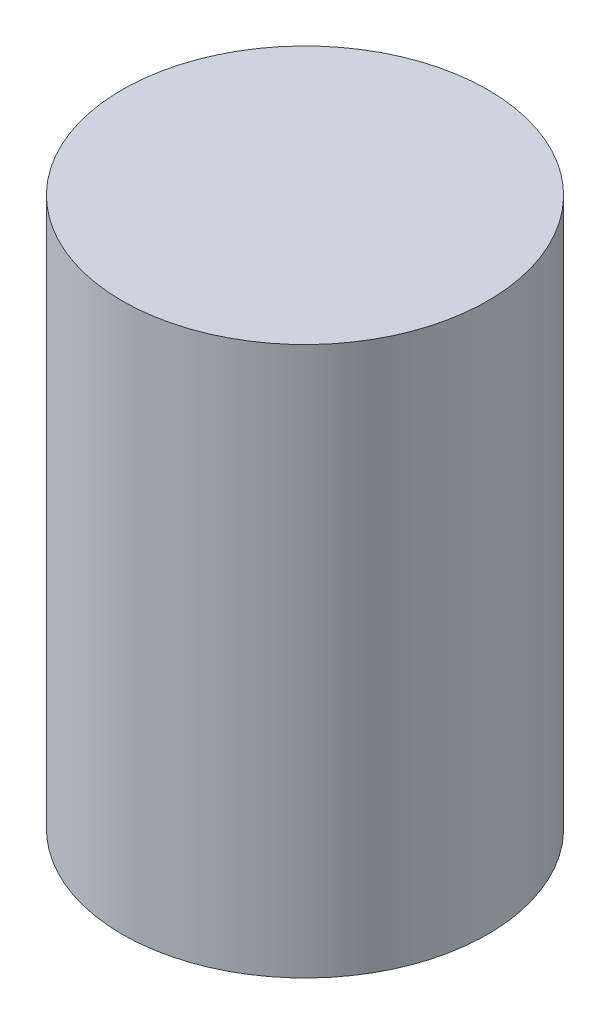
ISO-10303-21;
HEADER;
FILE_DESCRIPTION(('STEP AP214'),'2;1');
FILE_NAME('part.step','',(''),(''),'','','');
FILE_SCHEMA(('AUTOMOTIVE_DESIGN { 1 0 10303 214 1 1 1 1 }'));
ENDSEC;
DATA;
#1=APPLICATION_CONTEXT('core data for automotive mechanical design processes');
#2=APPLICATION_PROTOCOL_DEFINITION('international standard','automotive_design',2000,#1);
#3=PRODUCT_CONTEXT('',#1,'mechanical');
#4=PRODUCT('Part','Part','',(#3));
#5=PRODUCT_RELATED_PRODUCT_CATEGORY('part','',(#4));
#6=PRODUCT_DEFINITION_FORMATION('','',#4);
#7=PRODUCT_DEFINITION_CONTEXT('part definition',#1,'design');
#8=PRODUCT_DEFINITION('design','',#6,#7);
#9=PRODUCT_DEFINITION_SHAPE('','',#8);
#10=(LENGTH_UNIT() NAMED_UNIT(*) SI_UNIT(.MILLI.,.METRE.));
#11=(NAMED_UNIT(*) PLANE_ANGLE_UNIT() SI_UNIT($,.RADIAN.));
#12=(NAMED_UNIT(*) SI_UNIT($,.STERADIAN.) SOLID_ANGLE_UNIT());
#13=UNCERTAINTY_MEASURE_WITH_UNIT(LENGTH_MEASURE(1.E-05),#10,'distance_accuracy_value','');
#14=(GEOMETRIC_REPRESENTATION_CONTEXT(3) GLOBAL_UNCERTAINTY_ASSIGNED_CONTEXT((#13)) GLOBAL_UNIT_ASSIGNED_CONTEXT((#10,
#11,#12)) REPRESENTATION_CONTEXT('',''));
#15=CARTESIAN_POINT('',(0.,0.,0.));
#16=DIRECTION('',(0.,0.,1.));
#17=DIRECTION('',(1.,0.,0.));
#18=AXIS2_PLACEMENT_3D('',#15,#16,#17);
#19=CARTESIAN_POINT('',(0.,30.,0.));
#20=DIRECTION('',(0.,-1.,0.));
#21=DIRECTION('',(0.,0.,-1.));
#22=AXIS2_PLACEMENT_3D('',#19,#20,#21);
#23=CYLINDRICAL_SURFACE('',#22,10.);
#24=CARTESIAN_POINT('',(0.,30.,0.));
#25=DIRECTION('',(0.,1.,0.));
#26=DIRECTION('',(0.,0.,1.));
#27=AXIS2_PLACEMENT_3D('',#24,#25,#26);
#28=CIRCLE('',#27,10.);
#29=CARTESIAN_POINT('',(0.,30.,10.));
#30=VERTEX_POINT('',#29);
#31=EDGE_CURVE('E10',#30,#30,#28,.T.);
#32=ORIENTED_EDGE('',*,*,#31,.F.);
#33=EDGE_LOOP('',(#32));
#34=FACE_BOUND('',#33,.T.);
#35=CARTESIAN_POINT('',(0.,0.,0.));
#36=DIRECTION('',(0.,1.,0.));
#37=DIRECTION('',(0.,0.,1.));
#38=AXIS2_PLACEMENT_3D('',#35,#36,#37);
#39=CIRCLE('',#38,10.);
#40=CARTESIAN_POINT('',(0.,0.,10.));
#41=VERTEX_POINT('',#40);
#42=EDGE_CURVE('E42',#41,#41,#39,.T.);
#43=ORIENTED_EDGE('',*,*,#42,.T.);
#44=EDGE_LOOP('',(#43));
#45=FACE_BOUND('',#44,.T.);
#46=ADVANCED_FACE('F39',(#34,#45),#23,.T.);
#47=CARTESIAN_POINT('',(0.,30.,0.));
#48=DIRECTION('',(0.,1.,0.));
#49=DIRECTION('',(0.,0.,1.));
#50=AXIS2_PLACEMENT_3D('',#47,#48,#49);
#51=PLANE('',#50);
#52=ORIENTED_EDGE('',*,*,#31,.T.);
#53=EDGE_LOOP('',(#52));
#54=FACE_BOUND('',#53,.T.);
#55=ADVANCED_FACE('F54',(#54),#51,.T.);
#56=CARTESIAN_POINT('',(0.,0.,0.));
#57=DIRECTION('',(0.,1.,0.));
#58=DIRECTION('',(0.,0.,1.));
#59=AXIS2_PLACEMENT_3D('',#56,#57,#58);
#60=PLANE('',#59);
#61=ORIENTED_EDGE('',*,*,#42,.F.);
#62=EDGE_LOOP('',(#61));
#63=FACE_BOUND('',#62,.T.);
#64=ADVANCED_FACE('F52',(#63),#60,.F.);
#65=CLOSED_SHELL('',(#46,#55,#64));
#66=MANIFOLD_SOLID_BREP('B2',#65);
#67=ADVANCED_BREP_SHAPE_REPRESENTATION('',(#18,#66),#14);
#68=SHAPE_DEFINITION_REPRESENTATION(#9,#67);
ENDSEC;
END-ISO-10303-21;
